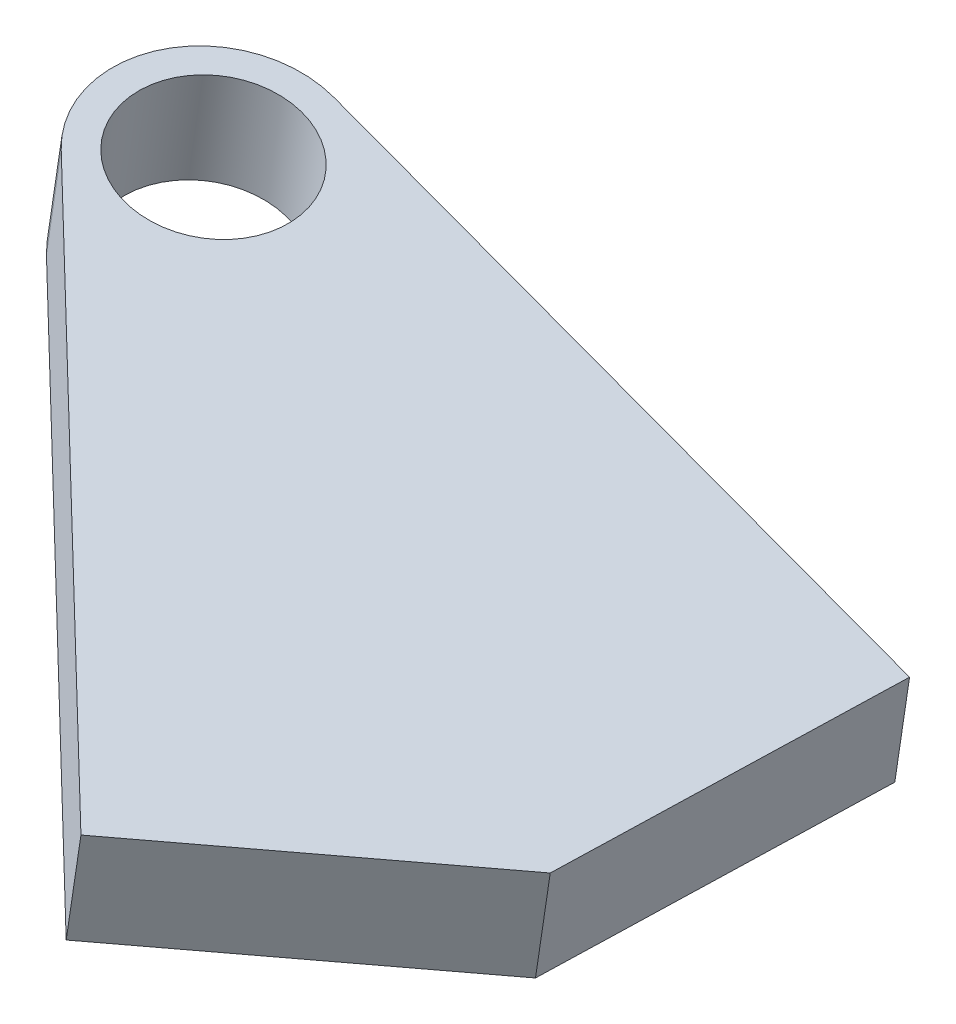
ISO-10303-21;
HEADER;
FILE_DESCRIPTION(('STEP AP214'),'2;1');
FILE_NAME('part.step','',(''),(''),'','','');
FILE_SCHEMA(('AUTOMOTIVE_DESIGN { 1 0 10303 214 1 1 1 1 }'));
ENDSEC;
DATA;
#1=APPLICATION_CONTEXT('core data for automotive mechanical design processes');
#2=APPLICATION_PROTOCOL_DEFINITION('international standard','automotive_design',2000,#1);
#3=PRODUCT_CONTEXT('',#1,'mechanical');
#4=PRODUCT('Part','Part','',(#3));
#5=PRODUCT_RELATED_PRODUCT_CATEGORY('part','',(#4));
#6=PRODUCT_DEFINITION_FORMATION('','',#4);
#7=PRODUCT_DEFINITION_CONTEXT('part definition',#1,'design');
#8=PRODUCT_DEFINITION('design','',#6,#7);
#9=PRODUCT_DEFINITION_SHAPE('','',#8);
#10=(LENGTH_UNIT() NAMED_UNIT(*) SI_UNIT(.MILLI.,.METRE.));
#11=(NAMED_UNIT(*) PLANE_ANGLE_UNIT() SI_UNIT($,.RADIAN.));
#12=(NAMED_UNIT(*) SI_UNIT($,.STERADIAN.) SOLID_ANGLE_UNIT());
#13=UNCERTAINTY_MEASURE_WITH_UNIT(LENGTH_MEASURE(1.E-05),#10,'distance_accuracy_value','');
#14=(GEOMETRIC_REPRESENTATION_CONTEXT(3) GLOBAL_UNCERTAINTY_ASSIGNED_CONTEXT((#13)) GLOBAL_UNIT_ASSIGNED_CONTEXT((#10,
#11,#12)) REPRESENTATION_CONTEXT('',''));
#15=CARTESIAN_POINT('',(0.,0.,0.));
#16=DIRECTION('',(0.,0.,1.));
#17=DIRECTION('',(1.,0.,0.));
#18=AXIS2_PLACEMENT_3D('',#15,#16,#17);
#19=CARTESIAN_POINT('',(-578.702048567568,296.200938198375,-784.743505458913));
#20=DIRECTION('',(-0.20440180038287,-0.976525700531443,-0.0679518962341525));
#21=DIRECTION('',(0.978788072642181,-0.204875349550413,0.));
#22=AXIS2_PLACEMENT_3D('',#19,#20,#21);
#23=CYLINDRICAL_SURFACE('',#22,12.7);
#24=DIRECTION('',(-0.20440180038287,-0.976525700531443,-0.0679518962341525));
#25=VECTOR('',#24,1.);
#26=CARTESIAN_POINT('',(-577.158500605645,296.754187406313,-797.337209243073));
#27=LINE('',#26,#25);
#28=CARTESIAN_POINT('',(-577.158500605645,296.754187406313,-797.337209243073));
#29=VERTEX_POINT('',#28);
#30=CARTESIAN_POINT('',(-579.754403470508,284.352311009564,-798.200198325246));
#31=VERTEX_POINT('',#30);
#32=EDGE_CURVE('E63',#29,#31,#27,.T.);
#33=ORIENTED_EDGE('',*,*,#32,.T.);
#34=CARTESIAN_POINT('',(-581.297951432431,283.799061801625,-785.606494541087));
#35=DIRECTION('',(-0.20440180038287,-0.976525700531442,-0.0679518962341525));
#36=DIRECTION('',(0.978788072642181,-0.204875349550413,0.));
#37=AXIS2_PLACEMENT_3D('',#34,#35,#36);
#38=CIRCLE('',#37,12.7);
#39=CARTESIAN_POINT('',(-589.88176969674,284.94941096621,-776.317535460282));
#40=VERTEX_POINT('',#39);
#41=EDGE_CURVE('E106',#40,#31,#38,.T.);
#42=ORIENTED_EDGE('',*,*,#41,.F.);
#43=DIRECTION('',(-0.20440180038287,-0.976525700531443,-0.0679518962341525));
#44=VECTOR('',#43,1.);
#45=CARTESIAN_POINT('',(-587.285866831878,297.35128736296,-775.454546378109));
#46=LINE('',#45,#44);
#47=CARTESIAN_POINT('',(-587.285866831878,297.35128736296,-775.454546378109));
#48=VERTEX_POINT('',#47);
#49=EDGE_CURVE('E12',#48,#40,#46,.T.);
#50=ORIENTED_EDGE('',*,*,#49,.F.);
#51=CARTESIAN_POINT('',(-578.702048567568,296.200938198375,-784.743505458913));
#52=DIRECTION('',(-0.20440180038287,-0.976525700531442,-0.0679518962341525));
#53=DIRECTION('',(0.978788072642181,-0.204875349550413,0.));
#54=AXIS2_PLACEMENT_3D('',#51,#52,#53);
#55=CIRCLE('',#54,12.7);
#56=EDGE_CURVE('E107',#48,#29,#55,.T.);
#57=ORIENTED_EDGE('',*,*,#56,.T.);
#58=EDGE_LOOP('',(#33,#42,#50,#57));
#59=FACE_BOUND('',#58,.T.);
#60=ADVANCED_FACE('F60',(#59),#23,.T.);
#61=CARTESIAN_POINT('',(-531.759779460931,282.026267788455,-722.245681737238));
#62=DIRECTION('',(-0.675891201914075,0.0905786743767582,0.73141410085074));
#63=DIRECTION('',(0.734433132957204,0.,0.678681054115013));
#64=AXIS2_PLACEMENT_3D('',#61,#62,#63);
#65=PLANE('',#64);
#66=ORIENTED_EDGE('',*,*,#49,.T.);
#67=DIRECTION('',(-0.708089674529567,0.195430447857351,-0.678539573551084));
#68=VECTOR('',#67,1.);
#69=CARTESIAN_POINT('',(-534.355682325794,269.624391391705,-723.108670819411));
#70=LINE('',#69,#68);
#71=CARTESIAN_POINT('',(-534.355682325794,269.624391391705,-723.108670819411));
#72=VERTEX_POINT('',#71);
#73=EDGE_CURVE('E125',#72,#40,#70,.T.);
#74=ORIENTED_EDGE('',*,*,#73,.F.);
#75=DIRECTION('',(-0.20440180038287,-0.976525700531443,-0.0679518962341525));
#76=VECTOR('',#75,1.);
#77=CARTESIAN_POINT('',(-531.759779460931,282.026267788455,-722.245681737238));
#78=LINE('',#77,#76);
#79=CARTESIAN_POINT('',(-531.759779460931,282.026267788455,-722.245681737238));
#80=VERTEX_POINT('',#79);
#81=EDGE_CURVE('E68',#80,#72,#78,.T.);
#82=ORIENTED_EDGE('',*,*,#81,.F.);
#83=DIRECTION('',(-0.708089674529567,0.195430447857351,-0.678539573551084));
#84=VECTOR('',#83,1.);
#85=CARTESIAN_POINT('',(-531.759779460931,282.026267788455,-722.245681737238));
#86=LINE('',#85,#84);
#87=EDGE_CURVE('E112',#80,#48,#86,.T.);
#88=ORIENTED_EDGE('',*,*,#87,.T.);
#89=EDGE_LOOP('',(#66,#74,#82,#88));
#90=FACE_BOUND('',#89,.T.);
#91=ADVANCED_FACE('F159',(#90),#65,.T.);
#92=CARTESIAN_POINT('',(-504.210060051687,278.175432791477,-749.776523522599));
#93=DIRECTION('',(0.680235967699129,-0.191615765549051,0.707504365104188));
#94=DIRECTION('',(0.720861922764217,0.,-0.693078702824345));
#95=AXIS2_PLACEMENT_3D('',#92,#93,#94);
#96=PLANE('',#95);
#97=ORIENTED_EDGE('',*,*,#81,.T.);
#98=DIRECTION('',(-0.703916850379837,0.0983918421142056,0.703434512344044));
#99=VECTOR('',#98,1.);
#100=CARTESIAN_POINT('',(-506.805962916549,265.773556394728,-750.639512604773));
#101=LINE('',#100,#99);
#102=CARTESIAN_POINT('',(-506.805962916549,265.773556394728,-750.639512604773));
#103=VERTEX_POINT('',#102);
#104=EDGE_CURVE('E132',#103,#72,#101,.T.);
#105=ORIENTED_EDGE('',*,*,#104,.F.);
#106=DIRECTION('',(-0.20440180038287,-0.976525700531443,-0.0679518962341525));
#107=VECTOR('',#106,1.);
#108=CARTESIAN_POINT('',(-504.210060051687,278.175432791477,-749.776523522599));
#109=LINE('',#108,#107);
#110=CARTESIAN_POINT('',(-504.210060051687,278.175432791477,-749.776523522599));
#111=VERTEX_POINT('',#110);
#112=EDGE_CURVE('E148',#111,#103,#109,.T.);
#113=ORIENTED_EDGE('',*,*,#112,.F.);
#114=DIRECTION('',(-0.703916850379837,0.0983918421142056,0.703434512344044));
#115=VECTOR('',#114,1.);
#116=CARTESIAN_POINT('',(-504.210060051687,278.175432791477,-749.776523522599));
#117=LINE('',#116,#115);
#118=EDGE_CURVE('E144',#111,#80,#117,.T.);
#119=ORIENTED_EDGE('',*,*,#118,.T.);
#120=EDGE_LOOP('',(#97,#105,#113,#119));
#121=FACE_BOUND('',#120,.T.);
#122=ADVANCED_FACE('F155',(#121),#96,.T.);
#123=CARTESIAN_POINT('',(-500.991329948435,280.21218903791,-788.728476228821));
#124=DIRECTION('',(0.975426220008265,-0.209019904287485,0.06967330142916));
#125=DIRECTION('',(0.209529088730873,0.977802414077409,0.));
#126=AXIS2_PLACEMENT_3D('',#123,#124,#125);
#127=PLANE('',#126);
#128=ORIENTED_EDGE('',*,*,#112,.T.);
#129=DIRECTION('',(-0.0822410683334643,-0.0520407130353338,0.995252817562525));
#130=VECTOR('',#129,1.);
#131=CARTESIAN_POINT('',(-503.587232813298,267.81031264116,-789.591465310994));
#132=LINE('',#131,#130);
#133=CARTESIAN_POINT('',(-503.587232813298,267.81031264116,-789.591465310994));
#134=VERTEX_POINT('',#133);
#135=EDGE_CURVE('E119',#134,#103,#132,.T.);
#136=ORIENTED_EDGE('',*,*,#135,.F.);
#137=DIRECTION('',(-0.20440180038287,-0.976525700531443,-0.0679518962341525));
#138=VECTOR('',#137,1.);
#139=CARTESIAN_POINT('',(-500.991329948435,280.21218903791,-788.728476228821));
#140=LINE('',#139,#138);
#141=CARTESIAN_POINT('',(-500.991329948435,280.21218903791,-788.728476228821));
#142=VERTEX_POINT('',#141);
#143=EDGE_CURVE('E111',#142,#134,#140,.T.);
#144=ORIENTED_EDGE('',*,*,#143,.F.);
#145=DIRECTION('',(-0.0822410683334643,-0.0520407130353338,0.995252817562525));
#146=VECTOR('',#145,1.);
#147=CARTESIAN_POINT('',(-500.991329948435,280.21218903791,-788.728476228821));
#148=LINE('',#147,#146);
#149=EDGE_CURVE('E141',#142,#111,#148,.T.);
#150=ORIENTED_EDGE('',*,*,#149,.T.);
#151=EDGE_LOOP('',(#128,#136,#144,#150));
#152=FACE_BOUND('',#151,.T.);
#153=ADVANCED_FACE('F150',(#152),#127,.T.);
#154=CARTESIAN_POINT('',(-577.158500605645,296.754187406313,-797.337209243073));
#155=DIRECTION('',(0.121539209600301,0.0435629297589146,-0.991630219225168));
#156=DIRECTION('',(-0.992572483195971,0.,-0.121654698233086));
#157=AXIS2_PLACEMENT_3D('',#154,#155,#156);
#158=PLANE('',#157);
#159=ORIENTED_EDGE('',*,*,#143,.T.);
#160=DIRECTION('',(0.971312578179638,-0.210949821882824,0.109781820524297));
#161=VECTOR('',#160,1.);
#162=CARTESIAN_POINT('',(-579.754403470508,284.352311009564,-798.200198325246));
#163=LINE('',#162,#161);
#164=EDGE_CURVE('E114',#31,#134,#163,.T.);
#165=ORIENTED_EDGE('',*,*,#164,.F.);
#166=ORIENTED_EDGE('',*,*,#32,.F.);
#167=DIRECTION('',(0.971312578179638,-0.210949821882824,0.109781820524297));
#168=VECTOR('',#167,1.);
#169=CARTESIAN_POINT('',(-577.158500605645,296.754187406313,-797.337209243073));
#170=LINE('',#169,#168);
#171=EDGE_CURVE('E139',#29,#142,#170,.T.);
#172=ORIENTED_EDGE('',*,*,#171,.T.);
#173=EDGE_LOOP('',(#159,#165,#166,#172));
#174=FACE_BOUND('',#173,.T.);
#175=ADVANCED_FACE('F115',(#174),#158,.T.);
#176=CARTESIAN_POINT('',(-578.702048567568,296.200938198375,-784.743505458913));
#177=DIRECTION('',(-0.20440180038287,-0.976525700531442,-0.0679518962341525));
#178=DIRECTION('',(0.978788072642181,-0.204875349550413,0.));
#179=AXIS2_PLACEMENT_3D('',#176,#177,#178);
#180=PLANE('',#179);
#181=CARTESIAN_POINT('',(-578.702048567569,296.200938198375,-784.743505458913));
#182=DIRECTION('',(-0.20440180038287,-0.976525700531442,-0.0679518962341525));
#183=DIRECTION('',(0.978788072642181,-0.204875349550413,0.));
#184=AXIS2_PLACEMENT_3D('',#181,#182,#183);
#185=CIRCLE('',#184,9.39800000000012);
#186=CARTESIAN_POINT('',(-569.503398260877,294.2755196633,-784.743505458913));
#187=VERTEX_POINT('',#186);
#188=EDGE_CURVE('E135',#187,#187,#185,.T.);
#189=ORIENTED_EDGE('',*,*,#188,.T.);
#190=EDGE_LOOP('',(#189));
#191=FACE_BOUND('',#190,.T.);
#192=ORIENTED_EDGE('',*,*,#56,.F.);
#193=ORIENTED_EDGE('',*,*,#87,.F.);
#194=ORIENTED_EDGE('',*,*,#118,.F.);
#195=ORIENTED_EDGE('',*,*,#149,.F.);
#196=ORIENTED_EDGE('',*,*,#171,.F.);
#197=EDGE_LOOP('',(#192,#193,#194,#195,#196));
#198=FACE_BOUND('',#197,.T.);
#199=ADVANCED_FACE('F158',(#191,#198),#180,.F.);
#200=CARTESIAN_POINT('',(-578.702048567569,296.200938198375,-784.743505458913));
#201=DIRECTION('',(-0.20440180038287,-0.976525700531443,-0.0679518962341525));
#202=DIRECTION('',(0.978788072642181,-0.204875349550413,0.));
#203=AXIS2_PLACEMENT_3D('',#200,#201,#202);
#204=CYLINDRICAL_SURFACE('',#203,9.39800000000012);
#205=ORIENTED_EDGE('',*,*,#188,.F.);
#206=EDGE_LOOP('',(#205));
#207=FACE_BOUND('',#206,.T.);
#208=CARTESIAN_POINT('',(-581.297951432431,283.799061801625,-785.606494541087));
#209=DIRECTION('',(-0.20440180038287,-0.976525700531442,-0.0679518962341525));
#210=DIRECTION('',(0.978788072642181,-0.204875349550413,0.));
#211=AXIS2_PLACEMENT_3D('',#208,#209,#210);
#212=CIRCLE('',#211,9.39800000000012);
#213=CARTESIAN_POINT('',(-572.09930112574,281.873643266551,-785.606494541087));
#214=VERTEX_POINT('',#213);
#215=EDGE_CURVE('E126',#214,#214,#212,.T.);
#216=ORIENTED_EDGE('',*,*,#215,.T.);
#217=EDGE_LOOP('',(#216));
#218=FACE_BOUND('',#217,.T.);
#219=ADVANCED_FACE('F175',(#207,#218),#204,.F.);
#220=CARTESIAN_POINT('',(-581.297951432431,283.799061801625,-785.606494541087));
#221=DIRECTION('',(-0.20440180038287,-0.976525700531442,-0.0679518962341525));
#222=DIRECTION('',(0.978788072642181,-0.204875349550413,0.));
#223=AXIS2_PLACEMENT_3D('',#220,#221,#222);
#224=PLANE('',#223);
#225=ORIENTED_EDGE('',*,*,#41,.T.);
#226=ORIENTED_EDGE('',*,*,#164,.T.);
#227=ORIENTED_EDGE('',*,*,#135,.T.);
#228=ORIENTED_EDGE('',*,*,#104,.T.);
#229=ORIENTED_EDGE('',*,*,#73,.T.);
#230=EDGE_LOOP('',(#225,#226,#227,#228,#229));
#231=FACE_BOUND('',#230,.T.);
#232=ORIENTED_EDGE('',*,*,#215,.F.);
#233=EDGE_LOOP('',(#232));
#234=FACE_BOUND('',#233,.T.);
#235=ADVANCED_FACE('F122',(#231,#234),#224,.T.);
#236=CLOSED_SHELL('',(#60,#91,#122,#153,#175,#199,#219,#235));
#237=MANIFOLD_SOLID_BREP('B2',#236);
#238=CARTESIAN_POINT('',(-529.039003916598,270.,-763.201071963402));
#239=DIRECTION('',(-0.302675931779964,0.,0.953093531780135));
#240=DIRECTION('',(0.953093531780135,0.,0.302675931779964));
#241=AXIS2_PLACEMENT_3D('',#238,#239,#240);
#242=CYLINDRICAL_SURFACE('',#241,9.52500000000012);
#243=CARTESIAN_POINT('',(-529.039003916598,270.,-763.201071963402));
#244=DIRECTION('',(-0.302675931779964,0.,0.953093531780135));
#245=DIRECTION('',(0.953093531780135,0.,0.302675931779964));
#246=AXIS2_PLACEMENT_3D('',#243,#244,#245);
#247=CIRCLE('',#246,9.52500000000012);
#248=CARTESIAN_POINT('',(-519.960788026393,270.,-760.318083713198));
#249=VERTEX_POINT('',#248);
#250=EDGE_CURVE('E59',#249,#249,#247,.T.);
#251=CARTESIAN_POINT('',(-530.960996083401,270.,-757.148928036598));
#252=DIRECTION('',(-0.302675931779964,0.,0.953093531780135));
#253=DIRECTION('',(0.953093531780135,0.,0.302675931779964));
#254=AXIS2_PLACEMENT_3D('',#251,#252,#253);
#255=CIRCLE('',#254,9.52500000000012);
#256=CARTESIAN_POINT('',(-521.882780193195,270.,-754.265939786394));
#257=VERTEX_POINT('',#256);
#258=EDGE_CURVE('E250',#257,#257,#255,.T.);
#259=CARTESIAN_POINT('',(-519.960788026393,270.,-760.318083713198));
#260=CARTESIAN_POINT('',(-519.98080877813,270.,-760.255040547293));
#261=CARTESIAN_POINT('',(-520.000829529868,270.,-760.191997381389));
#262=CARTESIAN_POINT('',(-520.040871033343,270.,-760.065911049581));
#263=CARTESIAN_POINT('',(-520.06089178508,270.,-760.002867883677));
#264=CARTESIAN_POINT('',(-520.100933288555,270.,-759.876781551868));
#265=CARTESIAN_POINT('',(-520.120954040293,270.,-759.813738385964));
#266=CARTESIAN_POINT('',(-520.160995543768,270.,-759.687652054156));
#267=CARTESIAN_POINT('',(-520.181016295506,270.,-759.624608888251));
#268=CARTESIAN_POINT('',(-520.22105779898,270.,-759.498522556443));
#269=CARTESIAN_POINT('',(-520.241078550718,270.,-759.435479390539));
#270=CARTESIAN_POINT('',(-520.281120054193,270.,-759.30939305873));
#271=CARTESIAN_POINT('',(-520.30114080593,270.,-759.246349892826));
#272=CARTESIAN_POINT('',(-520.341182309406,270.,-759.120263561018));
#273=CARTESIAN_POINT('',(-520.361203061143,270.,-759.057220395114));
#274=CARTESIAN_POINT('',(-520.401244564618,270.,-758.931134063305));
#275=CARTESIAN_POINT('',(-520.421265316356,270.,-758.868090897401));
#276=CARTESIAN_POINT('',(-520.461306819831,270.,-758.742004565593));
#277=CARTESIAN_POINT('',(-520.481327571568,270.,-758.678961399688));
#278=CARTESIAN_POINT('',(-520.521369075043,270.,-758.55287506788));
#279=CARTESIAN_POINT('',(-520.541389826781,270.,-758.489831901976));
#280=CARTESIAN_POINT('',(-520.581431330256,270.,-758.363745570167));
#281=CARTESIAN_POINT('',(-520.601452081993,270.,-758.300702404263));
#282=CARTESIAN_POINT('',(-520.641493585469,270.,-758.174616072455));
#283=CARTESIAN_POINT('',(-520.661514337206,270.,-758.11157290655));
#284=CARTESIAN_POINT('',(-520.701555840681,270.,-757.985486574742));
#285=CARTESIAN_POINT('',(-520.721576592419,270.,-757.922443408838));
#286=CARTESIAN_POINT('',(-520.761618095894,270.,-757.796357077029));
#287=CARTESIAN_POINT('',(-520.781638847631,270.,-757.733313911125));
#288=CARTESIAN_POINT('',(-520.821680351106,270.,-757.607227579317));
#289=CARTESIAN_POINT('',(-520.841701102844,270.,-757.544184413413));
#290=CARTESIAN_POINT('',(-520.881742606319,270.,-757.418098081604));
#291=CARTESIAN_POINT('',(-520.901763358056,270.,-757.3550549157));
#292=CARTESIAN_POINT('',(-520.941804861532,270.,-757.228968583892));
#293=CARTESIAN_POINT('',(-520.961825613269,270.,-757.165925417987));
#294=CARTESIAN_POINT('',(-521.001867116744,270.,-757.039839086179));
#295=CARTESIAN_POINT('',(-521.021887868482,270.,-756.976795920275));
#296=CARTESIAN_POINT('',(-521.061929371957,270.,-756.850709588466));
#297=CARTESIAN_POINT('',(-521.081950123694,270.,-756.787666422562));
#298=CARTESIAN_POINT('',(-521.121991627169,270.,-756.661580090754));
#299=CARTESIAN_POINT('',(-521.142012378907,270.,-756.59853692485));
#300=CARTESIAN_POINT('',(-521.182053882382,270.,-756.472450593041));
#301=CARTESIAN_POINT('',(-521.202074634119,270.,-756.409407427137));
#302=CARTESIAN_POINT('',(-521.242116137594,270.,-756.283321095328));
#303=CARTESIAN_POINT('',(-521.262136889332,270.,-756.220277929424));
#304=CARTESIAN_POINT('',(-521.302178392807,270.,-756.094191597616));
#305=CARTESIAN_POINT('',(-521.322199144544,270.,-756.031148431712));
#306=CARTESIAN_POINT('',(-521.36224064802,270.,-755.905062099903));
#307=CARTESIAN_POINT('',(-521.382261399757,270.,-755.842018933999));
#308=CARTESIAN_POINT('',(-521.422302903232,270.,-755.715932602191));
#309=CARTESIAN_POINT('',(-521.44232365497,270.,-755.652889436287));
#310=CARTESIAN_POINT('',(-521.482365158445,270.,-755.526803104478));
#311=CARTESIAN_POINT('',(-521.502385910182,270.,-755.463759938574));
#312=CARTESIAN_POINT('',(-521.542427413657,270.,-755.337673606765));
#313=CARTESIAN_POINT('',(-521.562448165395,270.,-755.274630440861));
#314=CARTESIAN_POINT('',(-521.60248966887,270.,-755.148544109053));
#315=CARTESIAN_POINT('',(-521.622510420607,270.,-755.085500943149));
#316=CARTESIAN_POINT('',(-521.662551924083,270.,-754.95941461134));
#317=CARTESIAN_POINT('',(-521.68257267582,270.,-754.896371445436));
#318=CARTESIAN_POINT('',(-521.722614179295,270.,-754.770285113628));
#319=CARTESIAN_POINT('',(-521.742634931033,270.,-754.707241947723));
#320=CARTESIAN_POINT('',(-521.782676434508,270.,-754.581155615915));
#321=CARTESIAN_POINT('',(-521.802697186245,270.,-754.518112450011));
#322=CARTESIAN_POINT('',(-521.84273868972,270.,-754.392026118202));
#323=CARTESIAN_POINT('',(-521.862759441458,270.,-754.328982952298));
#324=CARTESIAN_POINT('',(-521.882780193195,270.,-754.265939786394));
#325=B_SPLINE_CURVE_WITH_KNOTS('',3,(#259,#260,#261,#262,#263,#264,#265,#266,#267,#268,#269,
#270,#271,#272,#273,#274,#275,#276,#277,#278,#279,#280,#281,#282,#283,#284,#285,#286,#287,#288,
#289,#290,#291,#292,#293,#294,#295,#296,#297,#298,#299,#300,#301,#302,#303,#304,#305,#306,#307,
#308,#309,#310,#311,#312,#313,#314,#315,#316,#317,#318,#319,#320,#321,#322,#323,#324),
.UNSPECIFIED.,.F.,.F.,(4,2,2,2,2,2,2,2,2,2,2,2,2,2,2,2,2,2,2,2,2,2,2,2,2,2,2,2,2,2,2,2,4),(0.,
0.198437499999935,0.396874999999976,0.595312499999911,0.793749999999952,0.992187499999959,
1.19062499999989,1.38906249999994,1.58749999999998,1.78593749999991,1.98437499999995,
2.18281249999989,2.38124999999993,2.57968749999994,2.77812499999987,2.97656249999991,
3.17499999999985,3.37343749999989,3.57187499999993,3.77031249999986,3.96874999999987,
4.16718749999991,4.36562499999985,4.56406249999989,4.76249999999993,4.96093749999986,
5.1593749999999,5.35781249999981,5.55624999999985,5.75468749999989,5.95312499999982,
6.15156249999986,6.3499999999998),.UNSPECIFIED.);
#326=EDGE_CURVE('BSEAM240',#249,#257,#325,.T.);
#327=ORIENTED_EDGE('',*,*,#250,.T.);
#328=ORIENTED_EDGE('',*,*,#258,.F.);
#329=ORIENTED_EDGE('',*,*,#326,.T.);
#330=ORIENTED_EDGE('',*,*,#326,.F.);
#331=EDGE_LOOP('',(#327,#329,#328,#330));
#332=FACE_BOUND('',#331,.T.);
#333=ADVANCED_FACE('F240',(#332),#242,.T.);
#334=CARTESIAN_POINT('',(-529.039003916598,270.,-763.201071963402));
#335=DIRECTION('',(-0.302675931779964,0.,0.953093531780135));
#336=DIRECTION('',(0.953093531780135,0.,0.302675931779964));
#337=AXIS2_PLACEMENT_3D('',#334,#335,#336);
#338=PLANE('',#337);
#339=CARTESIAN_POINT('',(-529.039003916598,270.,-763.201071963402));
#340=DIRECTION('',(-0.302675931779964,0.,0.953093531780135));
#341=DIRECTION('',(0.953093531780135,0.,0.302675931779964));
#342=AXIS2_PLACEMENT_3D('',#339,#340,#341);
#343=CIRCLE('',#342,3.17500000000012);
#344=CARTESIAN_POINT('',(-526.012931953196,270.,-762.24007588));
#345=VERTEX_POINT('',#344);
#346=EDGE_CURVE('E246',#345,#345,#343,.T.);
#347=ORIENTED_EDGE('',*,*,#346,.T.);
#348=EDGE_LOOP('',(#347));
#349=FACE_BOUND('',#348,.T.);
#350=ORIENTED_EDGE('',*,*,#250,.F.);
#351=EDGE_LOOP('',(#350));
#352=FACE_BOUND('',#351,.T.);
#353=ADVANCED_FACE('F269',(#349,#352),#338,.F.);
#354=CARTESIAN_POINT('',(-529.039003916598,270.,-763.201071963402));
#355=DIRECTION('',(-0.302675931779964,0.,0.953093531780135));
#356=DIRECTION('',(0.953093531780135,0.,0.302675931779964));
#357=AXIS2_PLACEMENT_3D('',#354,#355,#356);
#358=CYLINDRICAL_SURFACE('',#357,3.17500000000012);
#359=CARTESIAN_POINT('',(-530.960996083401,270.,-757.148928036598));
#360=DIRECTION('',(-0.302675931779964,0.,0.953093531780135));
#361=DIRECTION('',(0.953093531780135,0.,0.302675931779964));
#362=AXIS2_PLACEMENT_3D('',#359,#360,#361);
#363=CIRCLE('',#362,3.17500000000012);
#364=CARTESIAN_POINT('',(-527.934924119999,270.,-756.187931953197));
#365=VERTEX_POINT('',#364);
#366=EDGE_CURVE('E254',#365,#365,#363,.T.);
#367=CARTESIAN_POINT('',(-526.012931953196,270.,-762.24007588));
#368=CARTESIAN_POINT('',(-526.032952704934,270.,-762.177032714096));
#369=CARTESIAN_POINT('',(-526.052973456671,270.,-762.113989548192));
#370=CARTESIAN_POINT('',(-526.093014960147,270.,-761.987903216384));
#371=CARTESIAN_POINT('',(-526.113035711884,270.,-761.924860050479));
#372=CARTESIAN_POINT('',(-526.153077215359,270.,-761.798773718671));
#373=CARTESIAN_POINT('',(-526.173097967097,270.,-761.735730552767));
#374=CARTESIAN_POINT('',(-526.213139470572,270.,-761.609644220958));
#375=CARTESIAN_POINT('',(-526.233160222309,270.,-761.546601055054));
#376=CARTESIAN_POINT('',(-526.273201725784,270.,-761.420514723246));
#377=CARTESIAN_POINT('',(-526.293222477522,270.,-761.357471557342));
#378=CARTESIAN_POINT('',(-526.333263980997,270.,-761.231385225533));
#379=CARTESIAN_POINT('',(-526.353284732734,270.,-761.168342059629));
#380=CARTESIAN_POINT('',(-526.39332623621,270.,-761.042255727821));
#381=CARTESIAN_POINT('',(-526.413346987947,270.,-760.979212561916));
#382=CARTESIAN_POINT('',(-526.453388491422,270.,-760.853126230108));
#383=CARTESIAN_POINT('',(-526.473409243159,270.,-760.790083064204));
#384=CARTESIAN_POINT('',(-526.513450746635,270.,-760.663996732395));
#385=CARTESIAN_POINT('',(-526.533471498372,270.,-760.600953566491));
#386=CARTESIAN_POINT('',(-526.573513001847,270.,-760.474867234683));
#387=CARTESIAN_POINT('',(-526.593533753585,270.,-760.411824068779));
#388=CARTESIAN_POINT('',(-526.63357525706,270.,-760.28573773697));
#389=CARTESIAN_POINT('',(-526.653596008797,270.,-760.222694571066));
#390=CARTESIAN_POINT('',(-526.693637512273,270.,-760.096608239258));
#391=CARTESIAN_POINT('',(-526.71365826401,270.,-760.033565073353));
#392=CARTESIAN_POINT('',(-526.753699767485,270.,-759.907478741545));
#393=CARTESIAN_POINT('',(-526.773720519222,270.,-759.844435575641));
#394=CARTESIAN_POINT('',(-526.813762022697,270.,-759.718349243832));
#395=CARTESIAN_POINT('',(-526.833782774435,270.,-759.655306077928));
#396=CARTESIAN_POINT('',(-526.87382427791,270.,-759.52921974612));
#397=CARTESIAN_POINT('',(-526.893845029648,270.,-759.466176580215));
#398=CARTESIAN_POINT('',(-526.933886533123,270.,-759.340090248407));
#399=CARTESIAN_POINT('',(-526.95390728486,270.,-759.277047082503));
#400=CARTESIAN_POINT('',(-526.993948788335,270.,-759.150960750694));
#401=CARTESIAN_POINT('',(-527.013969540073,270.,-759.08791758479));
#402=CARTESIAN_POINT('',(-527.054011043548,270.,-758.961831252982));
#403=CARTESIAN_POINT('',(-527.074031795285,270.,-758.898788087078));
#404=CARTESIAN_POINT('',(-527.114073298761,270.,-758.772701755269));
#405=CARTESIAN_POINT('',(-527.134094050498,270.,-758.709658589365));
#406=CARTESIAN_POINT('',(-527.174135553973,270.,-758.583572257557));
#407=CARTESIAN_POINT('',(-527.194156305711,270.,-758.520529091652));
#408=CARTESIAN_POINT('',(-527.234197809186,270.,-758.394442759844));
#409=CARTESIAN_POINT('',(-527.254218560923,270.,-758.33139959394));
#410=CARTESIAN_POINT('',(-527.294260064398,270.,-758.205313262131));
#411=CARTESIAN_POINT('',(-527.314280816136,270.,-758.142270096227));
#412=CARTESIAN_POINT('',(-527.354322319611,270.,-758.016183764419));
#413=CARTESIAN_POINT('',(-527.374343071348,270.,-757.953140598514));
#414=CARTESIAN_POINT('',(-527.414384574823,270.,-757.827054266706));
#415=CARTESIAN_POINT('',(-527.434405326561,270.,-757.764011100802));
#416=CARTESIAN_POINT('',(-527.474446830036,270.,-757.637924768993));
#417=CARTESIAN_POINT('',(-527.494467581774,270.,-757.574881603089));
#418=CARTESIAN_POINT('',(-527.534509085249,270.,-757.448795271281));
#419=CARTESIAN_POINT('',(-527.554529836986,270.,-757.385752105377));
#420=CARTESIAN_POINT('',(-527.594571340461,270.,-757.259665773568));
#421=CARTESIAN_POINT('',(-527.614592092199,270.,-757.196622607664));
#422=CARTESIAN_POINT('',(-527.654633595674,270.,-757.070536275856));
#423=CARTESIAN_POINT('',(-527.674654347411,270.,-757.007493109951));
#424=CARTESIAN_POINT('',(-527.714695850886,270.,-756.881406778143));
#425=CARTESIAN_POINT('',(-527.734716602624,270.,-756.818363612239));
#426=CARTESIAN_POINT('',(-527.774758106099,270.,-756.69227728043));
#427=CARTESIAN_POINT('',(-527.794778857836,270.,-756.629234114526));
#428=CARTESIAN_POINT('',(-527.834820361312,270.,-756.503147782718));
#429=CARTESIAN_POINT('',(-527.854841113049,270.,-756.440104616814));
#430=CARTESIAN_POINT('',(-527.894882616524,270.,-756.314018285005));
#431=CARTESIAN_POINT('',(-527.914903368262,270.,-756.250975119101));
#432=CARTESIAN_POINT('',(-527.934924119999,270.,-756.187931953197));
#433=B_SPLINE_CURVE_WITH_KNOTS('',3,(#367,#368,#369,#370,#371,#372,#373,#374,#375,#376,#377,
#378,#379,#380,#381,#382,#383,#384,#385,#386,#387,#388,#389,#390,#391,#392,#393,#394,#395,#396,
#397,#398,#399,#400,#401,#402,#403,#404,#405,#406,#407,#408,#409,#410,#411,#412,#413,#414,#415,
#416,#417,#418,#419,#420,#421,#422,#423,#424,#425,#426,#427,#428,#429,#430,#431,#432),
.UNSPECIFIED.,.F.,.F.,(4,2,2,2,2,2,2,2,2,2,2,2,2,2,2,2,2,2,2,2,2,2,2,2,2,2,2,2,2,2,2,2,4),(0.,
0.198437499999935,0.396874999999976,0.595312499999911,0.793749999999952,0.992187499999959,
1.19062499999989,1.38906249999994,1.58749999999998,1.78593749999991,1.98437499999995,
2.18281249999989,2.38124999999993,2.57968749999994,2.77812499999987,2.97656249999991,
3.17499999999985,3.37343749999989,3.57187499999993,3.77031249999986,3.96874999999987,
4.16718749999991,4.36562499999985,4.56406249999989,4.76249999999993,4.96093749999986,
5.1593749999999,5.35781249999981,5.55624999999985,5.75468749999989,5.95312499999982,
6.15156249999986,6.3499999999998),.UNSPECIFIED.);
#434=EDGE_CURVE('BSEAM260',#345,#365,#433,.T.);
#435=ORIENTED_EDGE('',*,*,#346,.F.);
#436=ORIENTED_EDGE('',*,*,#366,.T.);
#437=ORIENTED_EDGE('',*,*,#434,.T.);
#438=ORIENTED_EDGE('',*,*,#434,.F.);
#439=EDGE_LOOP('',(#435,#437,#436,#438));
#440=FACE_BOUND('',#439,.T.);
#441=ADVANCED_FACE('F260',(#440),#358,.F.);
#442=CARTESIAN_POINT('',(-530.960996083401,270.,-757.148928036598));
#443=DIRECTION('',(-0.302675931779964,0.,0.953093531780135));
#444=DIRECTION('',(0.953093531780135,0.,0.302675931779964));
#445=AXIS2_PLACEMENT_3D('',#442,#443,#444);
#446=PLANE('',#445);
#447=ORIENTED_EDGE('',*,*,#258,.T.);
#448=EDGE_LOOP('',(#447));
#449=FACE_BOUND('',#448,.T.);
#450=ORIENTED_EDGE('',*,*,#366,.F.);
#451=EDGE_LOOP('',(#450));
#452=FACE_BOUND('',#451,.T.);
#453=ADVANCED_FACE('F262',(#449,#452),#446,.T.);
#454=CLOSED_SHELL('',(#333,#353,#441,#453));
#455=MANIFOLD_SOLID_BREP('B6',#454);
#456=ADVANCED_BREP_SHAPE_REPRESENTATION('',(#18,#237,#455),#14);
#457=SHAPE_DEFINITION_REPRESENTATION(#9,#456);
ENDSEC;
END-ISO-10303-21;
